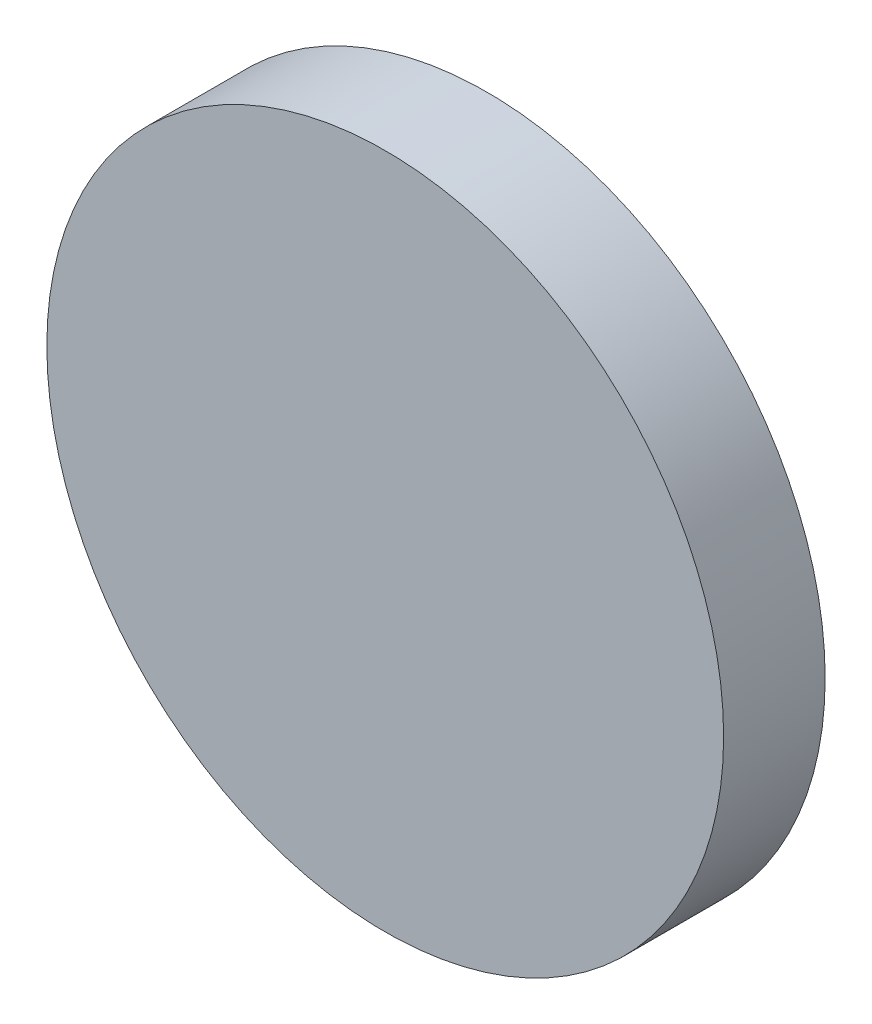
ISO-10303-21;
HEADER;
FILE_DESCRIPTION(('STEP AP214'),'2;1');
FILE_NAME('part.step','',(''),(''),'','','');
FILE_SCHEMA(('AUTOMOTIVE_DESIGN { 1 0 10303 214 1 1 1 1 }'));
ENDSEC;
DATA;
#1=APPLICATION_CONTEXT('core data for automotive mechanical design processes');
#2=APPLICATION_PROTOCOL_DEFINITION('international standard','automotive_design',2000,#1);
#3=PRODUCT_CONTEXT('',#1,'mechanical');
#4=PRODUCT('Part','Part','',(#3));
#5=PRODUCT_RELATED_PRODUCT_CATEGORY('part','',(#4));
#6=PRODUCT_DEFINITION_FORMATION('','',#4);
#7=PRODUCT_DEFINITION_CONTEXT('part definition',#1,'design');
#8=PRODUCT_DEFINITION('design','',#6,#7);
#9=PRODUCT_DEFINITION_SHAPE('','',#8);
#10=(LENGTH_UNIT() NAMED_UNIT(*) SI_UNIT(.MILLI.,.METRE.));
#11=(NAMED_UNIT(*) PLANE_ANGLE_UNIT() SI_UNIT($,.RADIAN.));
#12=(NAMED_UNIT(*) SI_UNIT($,.STERADIAN.) SOLID_ANGLE_UNIT());
#13=UNCERTAINTY_MEASURE_WITH_UNIT(LENGTH_MEASURE(1.E-05),#10,'distance_accuracy_value','');
#14=(GEOMETRIC_REPRESENTATION_CONTEXT(3) GLOBAL_UNCERTAINTY_ASSIGNED_CONTEXT((#13)) GLOBAL_UNIT_ASSIGNED_CONTEXT((#10,
#11,#12)) REPRESENTATION_CONTEXT('',''));
#15=CARTESIAN_POINT('',(0.,0.,0.));
#16=DIRECTION('',(0.,0.,1.));
#17=DIRECTION('',(1.,0.,0.));
#18=AXIS2_PLACEMENT_3D('',#15,#16,#17);
#19=CARTESIAN_POINT('',(0.,0.,3.));
#20=DIRECTION('',(0.,0.,-1.));
#21=DIRECTION('',(-1.,0.,0.));
#22=AXIS2_PLACEMENT_3D('',#19,#20,#21);
#23=CYLINDRICAL_SURFACE('',#22,10.);
#24=CARTESIAN_POINT('',(0.,0.,3.));
#25=DIRECTION('',(0.,0.,1.));
#26=DIRECTION('',(1.,0.,0.));
#27=AXIS2_PLACEMENT_3D('',#24,#25,#26);
#28=CIRCLE('',#27,10.);
#29=CARTESIAN_POINT('',(10.,0.,3.));
#30=VERTEX_POINT('',#29);
#31=EDGE_CURVE('E10',#30,#30,#28,.T.);
#32=ORIENTED_EDGE('',*,*,#31,.F.);
#33=EDGE_LOOP('',(#32));
#34=FACE_BOUND('',#33,.T.);
#35=CARTESIAN_POINT('',(0.,0.,0.));
#36=DIRECTION('',(0.,0.,1.));
#37=DIRECTION('',(1.,0.,0.));
#38=AXIS2_PLACEMENT_3D('',#35,#36,#37);
#39=CIRCLE('',#38,10.);
#40=CARTESIAN_POINT('',(10.,0.,0.));
#41=VERTEX_POINT('',#40);
#42=EDGE_CURVE('E37',#41,#41,#39,.T.);
#43=ORIENTED_EDGE('',*,*,#42,.T.);
#44=EDGE_LOOP('',(#43));
#45=FACE_BOUND('',#44,.T.);
#46=ADVANCED_FACE('F40',(#34,#45),#23,.T.);
#47=CARTESIAN_POINT('',(0.,0.,3.));
#48=DIRECTION('',(0.,0.,1.));
#49=DIRECTION('',(1.,0.,0.));
#50=AXIS2_PLACEMENT_3D('',#47,#48,#49);
#51=PLANE('',#50);
#52=ORIENTED_EDGE('',*,*,#31,.T.);
#53=EDGE_LOOP('',(#52));
#54=FACE_BOUND('',#53,.T.);
#55=ADVANCED_FACE('F55',(#54),#51,.T.);
#56=CARTESIAN_POINT('',(0.,0.,0.));
#57=DIRECTION('',(0.,0.,1.));
#58=DIRECTION('',(1.,0.,0.));
#59=AXIS2_PLACEMENT_3D('',#56,#57,#58);
#60=PLANE('',#59);
#61=ORIENTED_EDGE('',*,*,#42,.F.);
#62=EDGE_LOOP('',(#61));
#63=FACE_BOUND('',#62,.T.);
#64=ADVANCED_FACE('F49',(#63),#60,.F.);
#65=CLOSED_SHELL('',(#46,#55,#64));
#66=MANIFOLD_SOLID_BREP('B2',#65);
#67=ADVANCED_BREP_SHAPE_REPRESENTATION('',(#18,#66),#14);
#68=SHAPE_DEFINITION_REPRESENTATION(#9,#67);
ENDSEC;
END-ISO-10303-21;
